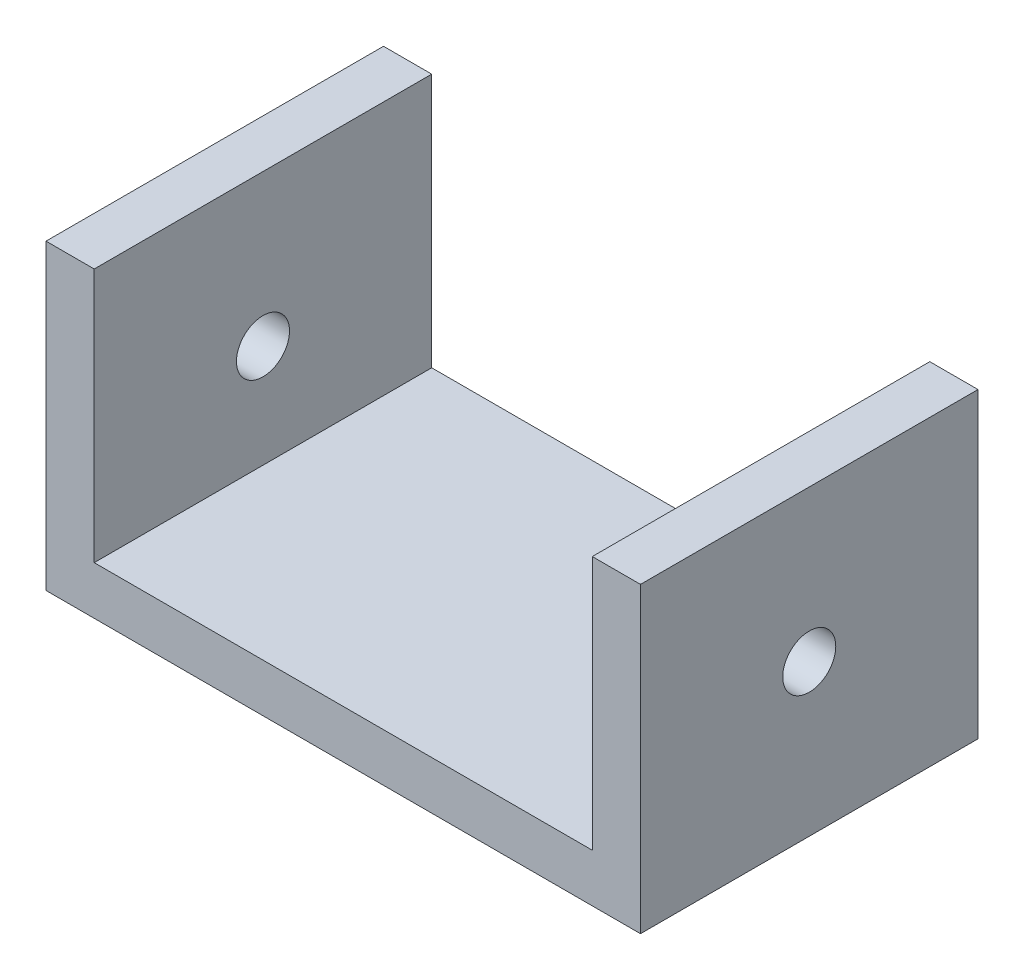
ISO-10303-21;
HEADER;
FILE_DESCRIPTION(('STEP AP214'),'2;1');
FILE_NAME('part.step','',(''),(''),'','','');
FILE_SCHEMA(('AUTOMOTIVE_DESIGN { 1 0 10303 214 1 1 1 1 }'));
ENDSEC;
DATA;
#1=APPLICATION_CONTEXT('core data for automotive mechanical design processes');
#2=APPLICATION_PROTOCOL_DEFINITION('international standard','automotive_design',2000,#1);
#3=PRODUCT_CONTEXT('',#1,'mechanical');
#4=PRODUCT('Part','Part','',(#3));
#5=PRODUCT_RELATED_PRODUCT_CATEGORY('part','',(#4));
#6=PRODUCT_DEFINITION_FORMATION('','',#4);
#7=PRODUCT_DEFINITION_CONTEXT('part definition',#1,'design');
#8=PRODUCT_DEFINITION('design','',#6,#7);
#9=PRODUCT_DEFINITION_SHAPE('','',#8);
#10=(LENGTH_UNIT() NAMED_UNIT(*) SI_UNIT(.MILLI.,.METRE.));
#11=(NAMED_UNIT(*) PLANE_ANGLE_UNIT() SI_UNIT($,.RADIAN.));
#12=(NAMED_UNIT(*) SI_UNIT($,.STERADIAN.) SOLID_ANGLE_UNIT());
#13=UNCERTAINTY_MEASURE_WITH_UNIT(LENGTH_MEASURE(1.E-05),#10,'distance_accuracy_value','');
#14=(GEOMETRIC_REPRESENTATION_CONTEXT(3) GLOBAL_UNCERTAINTY_ASSIGNED_CONTEXT((#13)) GLOBAL_UNIT_ASSIGNED_CONTEXT((#10,
#11,#12)) REPRESENTATION_CONTEXT('',''));
#15=CARTESIAN_POINT('',(0.,0.,0.));
#16=DIRECTION('',(0.,0.,1.));
#17=DIRECTION('',(1.,0.,0.));
#18=AXIS2_PLACEMENT_3D('',#15,#16,#17);
#19=CARTESIAN_POINT('',(-30.825,15.6875,35.));
#20=DIRECTION('',(0.,-1.,0.));
#21=DIRECTION('',(0.,0.,-1.));
#22=AXIS2_PLACEMENT_3D('',#19,#20,#21);
#23=PLANE('',#22);
#24=DIRECTION('',(-1.,0.,0.));
#25=VECTOR('',#24,1.);
#26=CARTESIAN_POINT('',(-30.825,15.6875,0.));
#27=LINE('',#26,#25);
#28=CARTESIAN_POINT('',(30.825,15.6875,0.));
#29=VERTEX_POINT('',#28);
#30=CARTESIAN_POINT('',(25.825,15.6875,0.));
#31=VERTEX_POINT('',#30);
#32=EDGE_CURVE('E179',#29,#31,#27,.T.);
#33=ORIENTED_EDGE('',*,*,#32,.T.);
#34=DIRECTION('',(0.,0.,-1.));
#35=VECTOR('',#34,1.);
#36=CARTESIAN_POINT('',(25.825,15.6875,35.));
#37=LINE('',#36,#35);
#38=CARTESIAN_POINT('',(25.825,15.6875,35.));
#39=VERTEX_POINT('',#38);
#40=EDGE_CURVE('E153',#39,#31,#37,.T.);
#41=ORIENTED_EDGE('',*,*,#40,.F.);
#42=DIRECTION('',(-1.,0.,0.));
#43=VECTOR('',#42,1.);
#44=CARTESIAN_POINT('',(-30.825,15.6875,35.));
#45=LINE('',#44,#43);
#46=CARTESIAN_POINT('',(30.825,15.6875,35.));
#47=VERTEX_POINT('',#46);
#48=EDGE_CURVE('E97',#47,#39,#45,.T.);
#49=ORIENTED_EDGE('',*,*,#48,.F.);
#50=DIRECTION('',(0.,0.,-1.));
#51=VECTOR('',#50,1.);
#52=CARTESIAN_POINT('',(30.825,15.6875,35.));
#53=LINE('',#52,#51);
#54=EDGE_CURVE('E11',#47,#29,#53,.T.);
#55=ORIENTED_EDGE('',*,*,#54,.T.);
#56=EDGE_LOOP('',(#33,#41,#49,#55));
#57=FACE_BOUND('',#56,.T.);
#58=ADVANCED_FACE('F43',(#57),#23,.F.);
#59=CARTESIAN_POINT('',(30.825,15.6875,35.));
#60=DIRECTION('',(-1.,0.,0.));
#61=DIRECTION('',(0.,0.,1.));
#62=AXIS2_PLACEMENT_3D('',#59,#60,#61);
#63=PLANE('',#62);
#64=CARTESIAN_POINT('',(30.825,0.,17.5));
#65=DIRECTION('',(1.,0.,0.));
#66=DIRECTION('',(0.,0.,-1.));
#67=AXIS2_PLACEMENT_3D('',#64,#65,#66);
#68=CIRCLE('',#67,2.75);
#69=CARTESIAN_POINT('',(30.825,0.,14.75));
#70=VERTEX_POINT('',#69);
#71=EDGE_CURVE('E344',#70,#70,#68,.T.);
#72=ORIENTED_EDGE('',*,*,#71,.F.);
#73=EDGE_LOOP('',(#72));
#74=FACE_BOUND('',#73,.T.);
#75=DIRECTION('',(0.,1.,0.));
#76=VECTOR('',#75,1.);
#77=CARTESIAN_POINT('',(30.825,15.6875,0.));
#78=LINE('',#77,#76);
#79=CARTESIAN_POINT('',(30.825,-15.6875,0.));
#80=VERTEX_POINT('',#79);
#81=EDGE_CURVE('E156',#80,#29,#78,.T.);
#82=ORIENTED_EDGE('',*,*,#81,.T.);
#83=ORIENTED_EDGE('',*,*,#54,.F.);
#84=DIRECTION('',(0.,1.,0.));
#85=VECTOR('',#84,1.);
#86=CARTESIAN_POINT('',(30.825,15.6875,35.));
#87=LINE('',#86,#85);
#88=CARTESIAN_POINT('',(30.825,-15.6875,35.));
#89=VERTEX_POINT('',#88);
#90=EDGE_CURVE('E163',#89,#47,#87,.T.);
#91=ORIENTED_EDGE('',*,*,#90,.F.);
#92=DIRECTION('',(0.,0.,-1.));
#93=VECTOR('',#92,1.);
#94=CARTESIAN_POINT('',(30.825,-15.6875,35.));
#95=LINE('',#94,#93);
#96=EDGE_CURVE('E174',#89,#80,#95,.T.);
#97=ORIENTED_EDGE('',*,*,#96,.T.);
#98=EDGE_LOOP('',(#82,#83,#91,#97));
#99=FACE_BOUND('',#98,.T.);
#100=ADVANCED_FACE('F45',(#74,#99),#63,.F.);
#101=CARTESIAN_POINT('',(-25.825,15.6875,35.));
#102=VERTEX_POINT('',#101);
#103=CARTESIAN_POINT('',(-30.825,15.6875,35.));
#104=VERTEX_POINT('',#103);
#105=EDGE_CURVE('E166',#102,#104,#45,.T.);
#106=ORIENTED_EDGE('',*,*,#105,.F.);
#107=DIRECTION('',(0.,0.,-1.));
#108=VECTOR('',#107,1.);
#109=CARTESIAN_POINT('',(-25.825,15.6875,35.));
#110=LINE('',#109,#108);
#111=CARTESIAN_POINT('',(-25.825,15.6875,0.));
#112=VERTEX_POINT('',#111);
#113=EDGE_CURVE('E157',#102,#112,#110,.T.);
#114=ORIENTED_EDGE('',*,*,#113,.T.);
#115=CARTESIAN_POINT('',(-30.825,15.6875,0.));
#116=VERTEX_POINT('',#115);
#117=EDGE_CURVE('E178',#112,#116,#27,.T.);
#118=ORIENTED_EDGE('',*,*,#117,.T.);
#119=DIRECTION('',(0.,0.,-1.));
#120=VECTOR('',#119,1.);
#121=CARTESIAN_POINT('',(-30.825,15.6875,35.));
#122=LINE('',#121,#120);
#123=EDGE_CURVE('E53',#104,#116,#122,.T.);
#124=ORIENTED_EDGE('',*,*,#123,.F.);
#125=EDGE_LOOP('',(#106,#114,#118,#124));
#126=FACE_BOUND('',#125,.T.);
#127=ADVANCED_FACE('F219',(#126),#23,.F.);
#128=CARTESIAN_POINT('',(-30.825,15.6875,35.));
#129=DIRECTION('',(1.,0.,0.));
#130=DIRECTION('',(0.,0.,-1.));
#131=AXIS2_PLACEMENT_3D('',#128,#129,#130);
#132=PLANE('',#131);
#133=CARTESIAN_POINT('',(-30.825,0.,17.5));
#134=DIRECTION('',(1.,0.,0.));
#135=DIRECTION('',(0.,0.,-1.));
#136=AXIS2_PLACEMENT_3D('',#133,#134,#135);
#137=CIRCLE('',#136,2.75);
#138=CARTESIAN_POINT('',(-30.825,0.,14.75));
#139=VERTEX_POINT('',#138);
#140=EDGE_CURVE('E349',#139,#139,#137,.T.);
#141=ORIENTED_EDGE('',*,*,#140,.T.);
#142=EDGE_LOOP('',(#141));
#143=FACE_BOUND('',#142,.T.);
#144=DIRECTION('',(0.,-1.,0.));
#145=VECTOR('',#144,1.);
#146=CARTESIAN_POINT('',(-30.825,15.6875,0.));
#147=LINE('',#146,#145);
#148=CARTESIAN_POINT('',(-30.825,-15.6875,0.));
#149=VERTEX_POINT('',#148);
#150=EDGE_CURVE('E183',#116,#149,#147,.T.);
#151=ORIENTED_EDGE('',*,*,#150,.T.);
#152=DIRECTION('',(0.,0.,-1.));
#153=VECTOR('',#152,1.);
#154=CARTESIAN_POINT('',(-30.825,-15.6875,35.));
#155=LINE('',#154,#153);
#156=CARTESIAN_POINT('',(-30.825,-15.6875,35.));
#157=VERTEX_POINT('',#156);
#158=EDGE_CURVE('E190',#157,#149,#155,.T.);
#159=ORIENTED_EDGE('',*,*,#158,.F.);
#160=DIRECTION('',(0.,-1.,0.));
#161=VECTOR('',#160,1.);
#162=CARTESIAN_POINT('',(-30.825,15.6875,35.));
#163=LINE('',#162,#161);
#164=EDGE_CURVE('E169',#104,#157,#163,.T.);
#165=ORIENTED_EDGE('',*,*,#164,.F.);
#166=ORIENTED_EDGE('',*,*,#123,.T.);
#167=EDGE_LOOP('',(#151,#159,#165,#166));
#168=FACE_BOUND('',#167,.T.);
#169=ADVANCED_FACE('F199',(#143,#168),#132,.F.);
#170=CARTESIAN_POINT('',(-30.825,-15.6875,35.));
#171=DIRECTION('',(0.,1.,0.));
#172=DIRECTION('',(0.,0.,1.));
#173=AXIS2_PLACEMENT_3D('',#170,#171,#172);
#174=PLANE('',#173);
#175=DIRECTION('',(1.,0.,0.));
#176=VECTOR('',#175,1.);
#177=CARTESIAN_POINT('',(-30.825,-15.6875,0.));
#178=LINE('',#177,#176);
#179=EDGE_CURVE('E90',#149,#80,#178,.T.);
#180=ORIENTED_EDGE('',*,*,#179,.T.);
#181=ORIENTED_EDGE('',*,*,#96,.F.);
#182=DIRECTION('',(1.,0.,0.));
#183=VECTOR('',#182,1.);
#184=CARTESIAN_POINT('',(-30.825,-15.6875,35.));
#185=LINE('',#184,#183);
#186=EDGE_CURVE('E69',#157,#89,#185,.T.);
#187=ORIENTED_EDGE('',*,*,#186,.F.);
#188=ORIENTED_EDGE('',*,*,#158,.T.);
#189=EDGE_LOOP('',(#180,#181,#187,#188));
#190=FACE_BOUND('',#189,.T.);
#191=ADVANCED_FACE('F211',(#190),#174,.F.);
#192=CARTESIAN_POINT('',(0.,0.,35.));
#193=DIRECTION('',(0.,0.,1.));
#194=DIRECTION('',(1.,0.,0.));
#195=AXIS2_PLACEMENT_3D('',#192,#193,#194);
#196=PLANE('',#195);
#197=DIRECTION('',(0.,-1.,0.));
#198=VECTOR('',#197,1.);
#199=CARTESIAN_POINT('',(25.825,15.6875,35.));
#200=LINE('',#199,#198);
#201=CARTESIAN_POINT('',(25.825,-10.6875,35.));
#202=VERTEX_POINT('',#201);
#203=EDGE_CURVE('E121',#39,#202,#200,.T.);
#204=ORIENTED_EDGE('',*,*,#203,.T.);
#205=DIRECTION('',(-1.,0.,0.));
#206=VECTOR('',#205,1.);
#207=CARTESIAN_POINT('',(25.825,-10.6875,35.));
#208=LINE('',#207,#206);
#209=CARTESIAN_POINT('',(-25.825,-10.6875,35.));
#210=VERTEX_POINT('',#209);
#211=EDGE_CURVE('E130',#202,#210,#208,.T.);
#212=ORIENTED_EDGE('',*,*,#211,.T.);
#213=DIRECTION('',(0.,1.,0.));
#214=VECTOR('',#213,1.);
#215=CARTESIAN_POINT('',(-25.825,15.6875,35.));
#216=LINE('',#215,#214);
#217=EDGE_CURVE('E127',#210,#102,#216,.T.);
#218=ORIENTED_EDGE('',*,*,#217,.T.);
#219=ORIENTED_EDGE('',*,*,#105,.T.);
#220=ORIENTED_EDGE('',*,*,#164,.T.);
#221=ORIENTED_EDGE('',*,*,#186,.T.);
#222=ORIENTED_EDGE('',*,*,#90,.T.);
#223=ORIENTED_EDGE('',*,*,#48,.T.);
#224=EDGE_LOOP('',(#204,#212,#218,#219,#220,#221,#222,#223));
#225=FACE_BOUND('',#224,.T.);
#226=ADVANCED_FACE('F136',(#225),#196,.T.);
#227=CARTESIAN_POINT('',(0.,0.,0.));
#228=DIRECTION('',(0.,0.,1.));
#229=DIRECTION('',(1.,0.,0.));
#230=AXIS2_PLACEMENT_3D('',#227,#228,#229);
#231=PLANE('',#230);
#232=DIRECTION('',(-1.,0.,0.));
#233=VECTOR('',#232,1.);
#234=CARTESIAN_POINT('',(25.825,-10.6875,0.));
#235=LINE('',#234,#233);
#236=CARTESIAN_POINT('',(25.825,-10.6875,0.));
#237=VERTEX_POINT('',#236);
#238=CARTESIAN_POINT('',(-25.825,-10.6875,0.));
#239=VERTEX_POINT('',#238);
#240=EDGE_CURVE('E141',#237,#239,#235,.T.);
#241=ORIENTED_EDGE('',*,*,#240,.F.);
#242=DIRECTION('',(0.,-1.,0.));
#243=VECTOR('',#242,1.);
#244=CARTESIAN_POINT('',(25.825,15.6875,0.));
#245=LINE('',#244,#243);
#246=EDGE_CURVE('E60',#31,#237,#245,.T.);
#247=ORIENTED_EDGE('',*,*,#246,.F.);
#248=ORIENTED_EDGE('',*,*,#32,.F.);
#249=ORIENTED_EDGE('',*,*,#81,.F.);
#250=ORIENTED_EDGE('',*,*,#179,.F.);
#251=ORIENTED_EDGE('',*,*,#150,.F.);
#252=ORIENTED_EDGE('',*,*,#117,.F.);
#253=DIRECTION('',(0.,1.,0.));
#254=VECTOR('',#253,1.);
#255=CARTESIAN_POINT('',(-25.825,15.6875,0.));
#256=LINE('',#255,#254);
#257=EDGE_CURVE('E138',#239,#112,#256,.T.);
#258=ORIENTED_EDGE('',*,*,#257,.F.);
#259=EDGE_LOOP('',(#241,#247,#248,#249,#250,#251,#252,#258));
#260=FACE_BOUND('',#259,.T.);
#261=ADVANCED_FACE('F205',(#260),#231,.F.);
#262=CARTESIAN_POINT('',(25.825,15.6875,35.));
#263=DIRECTION('',(1.,0.,0.));
#264=DIRECTION('',(0.,1.,0.));
#265=AXIS2_PLACEMENT_3D('',#262,#263,#264);
#266=PLANE('',#265);
#267=CARTESIAN_POINT('',(25.825,0.,17.5));
#268=DIRECTION('',(1.,0.,0.));
#269=DIRECTION('',(0.,1.,0.));
#270=AXIS2_PLACEMENT_3D('',#267,#268,#269);
#271=CIRCLE('',#270,2.75);
#272=CARTESIAN_POINT('',(25.825,2.75,17.5));
#273=VERTEX_POINT('',#272);
#274=EDGE_CURVE('E144',#273,#273,#271,.T.);
#275=ORIENTED_EDGE('',*,*,#274,.T.);
#276=EDGE_LOOP('',(#275));
#277=FACE_BOUND('',#276,.T.);
#278=ORIENTED_EDGE('',*,*,#246,.T.);
#279=DIRECTION('',(0.,0.,-1.));
#280=VECTOR('',#279,1.);
#281=CARTESIAN_POINT('',(25.825,-10.6875,35.));
#282=LINE('',#281,#280);
#283=EDGE_CURVE('E117',#202,#237,#282,.T.);
#284=ORIENTED_EDGE('',*,*,#283,.F.);
#285=ORIENTED_EDGE('',*,*,#203,.F.);
#286=ORIENTED_EDGE('',*,*,#40,.T.);
#287=EDGE_LOOP('',(#278,#284,#285,#286));
#288=FACE_BOUND('',#287,.T.);
#289=ADVANCED_FACE('F119',(#277,#288),#266,.F.);
#290=CARTESIAN_POINT('',(-25.825,15.6875,35.));
#291=DIRECTION('',(-1.,0.,0.));
#292=DIRECTION('',(0.,0.,1.));
#293=AXIS2_PLACEMENT_3D('',#290,#291,#292);
#294=PLANE('',#293);
#295=CARTESIAN_POINT('',(-25.825,0.,17.5));
#296=DIRECTION('',(-1.,0.,0.));
#297=DIRECTION('',(0.,0.,1.));
#298=AXIS2_PLACEMENT_3D('',#295,#296,#297);
#299=CIRCLE('',#298,2.75);
#300=CARTESIAN_POINT('',(-25.825,0.,20.25));
#301=VERTEX_POINT('',#300);
#302=EDGE_CURVE('E47',#301,#301,#299,.T.);
#303=ORIENTED_EDGE('',*,*,#302,.T.);
#304=EDGE_LOOP('',(#303));
#305=FACE_BOUND('',#304,.T.);
#306=ORIENTED_EDGE('',*,*,#257,.T.);
#307=ORIENTED_EDGE('',*,*,#113,.F.);
#308=ORIENTED_EDGE('',*,*,#217,.F.);
#309=DIRECTION('',(0.,0.,-1.));
#310=VECTOR('',#309,1.);
#311=CARTESIAN_POINT('',(-25.825,-10.6875,35.));
#312=LINE('',#311,#310);
#313=EDGE_CURVE('E126',#210,#239,#312,.T.);
#314=ORIENTED_EDGE('',*,*,#313,.T.);
#315=EDGE_LOOP('',(#306,#307,#308,#314));
#316=FACE_BOUND('',#315,.T.);
#317=ADVANCED_FACE('F234',(#305,#316),#294,.F.);
#318=CARTESIAN_POINT('',(25.825,-10.6875,35.));
#319=DIRECTION('',(0.,-1.,0.));
#320=DIRECTION('',(0.,0.,-1.));
#321=AXIS2_PLACEMENT_3D('',#318,#319,#320);
#322=PLANE('',#321);
#323=ORIENTED_EDGE('',*,*,#240,.T.);
#324=ORIENTED_EDGE('',*,*,#313,.F.);
#325=ORIENTED_EDGE('',*,*,#211,.F.);
#326=ORIENTED_EDGE('',*,*,#283,.T.);
#327=EDGE_LOOP('',(#323,#324,#325,#326));
#328=FACE_BOUND('',#327,.T.);
#329=ADVANCED_FACE('F131',(#328),#322,.F.);
#330=CARTESIAN_POINT('',(-30.825,0.,17.5));
#331=DIRECTION('',(1.,0.,0.));
#332=DIRECTION('',(0.,0.,-1.));
#333=AXIS2_PLACEMENT_3D('',#330,#331,#332);
#334=CYLINDRICAL_SURFACE('',#333,2.75);
#335=ORIENTED_EDGE('',*,*,#140,.F.);
#336=EDGE_LOOP('',(#335));
#337=FACE_BOUND('',#336,.T.);
#338=ORIENTED_EDGE('',*,*,#302,.F.);
#339=EDGE_LOOP('',(#338));
#340=FACE_BOUND('',#339,.T.);
#341=ADVANCED_FACE('F242',(#337,#340),#334,.F.);
#342=ORIENTED_EDGE('',*,*,#71,.T.);
#343=EDGE_LOOP('',(#342));
#344=FACE_BOUND('',#343,.T.);
#345=ORIENTED_EDGE('',*,*,#274,.F.);
#346=EDGE_LOOP('',(#345));
#347=FACE_BOUND('',#346,.T.);
#348=ADVANCED_FACE('F248',(#344,#347),#334,.F.);
#349=CLOSED_SHELL('',(#58,#100,#127,#169,#191,#226,#261,#289,#317,#329,#341,#348));
#350=MANIFOLD_SOLID_BREP('B2',#349);
#351=ADVANCED_BREP_SHAPE_REPRESENTATION('',(#18,#350),#14);
#352=SHAPE_DEFINITION_REPRESENTATION(#9,#351);
ENDSEC;
END-ISO-10303-21;
